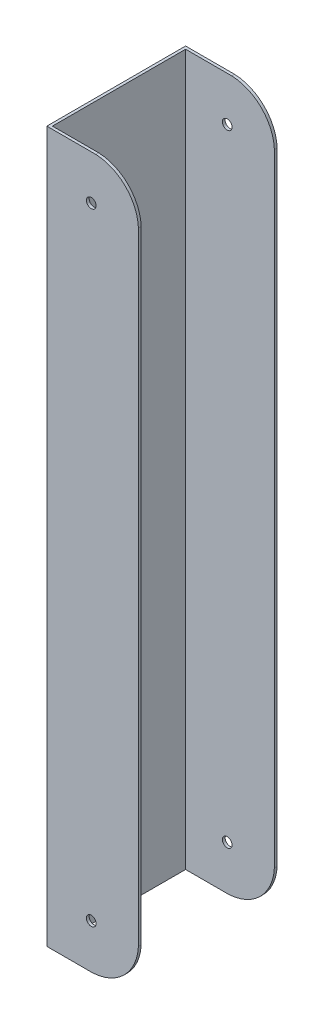
ISO-10303-21;
HEADER;
FILE_DESCRIPTION(('STEP AP214'),'2;1');
FILE_NAME('part.step','',(''),(''),'','','');
FILE_SCHEMA(('AUTOMOTIVE_DESIGN { 1 0 10303 214 1 1 1 1 }'));
ENDSEC;
DATA;
#1=APPLICATION_CONTEXT('core data for automotive mechanical design processes');
#2=APPLICATION_PROTOCOL_DEFINITION('international standard','automotive_design',2000,#1);
#3=PRODUCT_CONTEXT('',#1,'mechanical');
#4=PRODUCT('Part','Part','',(#3));
#5=PRODUCT_RELATED_PRODUCT_CATEGORY('part','',(#4));
#6=PRODUCT_DEFINITION_FORMATION('','',#4);
#7=PRODUCT_DEFINITION_CONTEXT('part definition',#1,'design');
#8=PRODUCT_DEFINITION('design','',#6,#7);
#9=PRODUCT_DEFINITION_SHAPE('','',#8);
#10=(LENGTH_UNIT() NAMED_UNIT(*) SI_UNIT(.MILLI.,.METRE.));
#11=(NAMED_UNIT(*) PLANE_ANGLE_UNIT() SI_UNIT($,.RADIAN.));
#12=(NAMED_UNIT(*) SI_UNIT($,.STERADIAN.) SOLID_ANGLE_UNIT());
#13=UNCERTAINTY_MEASURE_WITH_UNIT(LENGTH_MEASURE(1.E-05),#10,'distance_accuracy_value','');
#14=(GEOMETRIC_REPRESENTATION_CONTEXT(3) GLOBAL_UNCERTAINTY_ASSIGNED_CONTEXT((#13)) GLOBAL_UNIT_ASSIGNED_CONTEXT((#10,
#11,#12)) REPRESENTATION_CONTEXT('',''));
#15=CARTESIAN_POINT('',(0.,0.,0.));
#16=DIRECTION('',(0.,0.,1.));
#17=DIRECTION('',(1.,0.,0.));
#18=AXIS2_PLACEMENT_3D('',#15,#16,#17);
#19=CARTESIAN_POINT('',(-50.8,406.4,-1.58749999999998));
#20=DIRECTION('',(0.,0.,1.));
#21=DIRECTION('',(1.,0.,0.));
#22=AXIS2_PLACEMENT_3D('',#19,#20,#21);
#23=PLANE('',#22);
#24=CARTESIAN_POINT('',(-26.9875,25.4,-1.58749999999996));
#25=DIRECTION('',(0.,0.,1.));
#26=DIRECTION('',(1.,0.,0.));
#27=AXIS2_PLACEMENT_3D('',#24,#25,#26);
#28=CIRCLE('',#27,2.778125);
#29=CARTESIAN_POINT('',(-24.209375,25.4,-1.58749999999996));
#30=VERTEX_POINT('',#29);
#31=EDGE_CURVE('E231',#30,#30,#28,.T.);
#32=ORIENTED_EDGE('',*,*,#31,.T.);
#33=EDGE_LOOP('',(#32));
#34=FACE_BOUND('',#33,.T.);
#35=CARTESIAN_POINT('',(-26.9875,381.,-1.58749999999996));
#36=DIRECTION('',(0.,0.,1.));
#37=DIRECTION('',(1.,0.,0.));
#38=AXIS2_PLACEMENT_3D('',#35,#36,#37);
#39=CIRCLE('',#38,2.778125);
#40=CARTESIAN_POINT('',(-24.209375,381.,-1.58749999999996));
#41=VERTEX_POINT('',#40);
#42=EDGE_CURVE('E134',#41,#41,#39,.T.);
#43=ORIENTED_EDGE('',*,*,#42,.T.);
#44=EDGE_LOOP('',(#43));
#45=FACE_BOUND('',#44,.T.);
#46=DIRECTION('',(-1.,0.,0.));
#47=VECTOR('',#46,1.);
#48=CARTESIAN_POINT('',(-50.8,406.4,-1.58749999999998));
#49=LINE('',#48,#47);
#50=CARTESIAN_POINT('',(-24.3888362286901,406.4,-1.58749999999998));
#51=VERTEX_POINT('',#50);
#52=CARTESIAN_POINT('',(-50.8,406.4,-1.58749999999998));
#53=VERTEX_POINT('',#52);
#54=EDGE_CURVE('E161',#51,#53,#49,.T.);
#55=ORIENTED_EDGE('',*,*,#54,.F.);
#56=CARTESIAN_POINT('',(-25.2912931143452,381.108706885655,-1.58749999999996));
#57=DIRECTION('',(0.,0.,1.));
#58=DIRECTION('',(1.,0.,0.));
#59=AXIS2_PLACEMENT_3D('',#56,#57,#58);
#60=CIRCLE('',#59,25.3073889571048);
#61=CARTESIAN_POINT('',(0.,382.01116377131,-1.58749999999996));
#62=VERTEX_POINT('',#61);
#63=EDGE_CURVE('E56',#51,#62,#60,.F.);
#64=ORIENTED_EDGE('',*,*,#63,.T.);
#65=DIRECTION('',(0.,-1.,0.));
#66=VECTOR('',#65,1.);
#67=CARTESIAN_POINT('',(0.,406.4,-1.58749999999998));
#68=LINE('',#67,#66);
#69=CARTESIAN_POINT('',(0.,26.19375,-1.58749999999996));
#70=VERTEX_POINT('',#69);
#71=EDGE_CURVE('E177',#62,#70,#68,.T.);
#72=ORIENTED_EDGE('',*,*,#71,.T.);
#73=CARTESIAN_POINT('',(-27.6477853168564,27.6477853168564,-1.58749999999996));
#74=DIRECTION('',(0.,0.,1.));
#75=DIRECTION('',(1.,0.,0.));
#76=AXIS2_PLACEMENT_3D('',#73,#74,#75);
#77=CIRCLE('',#76,27.6859937807847);
#78=CARTESIAN_POINT('',(-26.19375,0.,-1.58749999999996));
#79=VERTEX_POINT('',#78);
#80=EDGE_CURVE('E150',#79,#70,#77,.T.);
#81=ORIENTED_EDGE('',*,*,#80,.F.);
#82=DIRECTION('',(-1.,0.,0.));
#83=VECTOR('',#82,1.);
#84=CARTESIAN_POINT('',(-50.8,0.,-1.58749999999998));
#85=LINE('',#84,#83);
#86=CARTESIAN_POINT('',(-50.8,0.,-1.58749999999998));
#87=VERTEX_POINT('',#86);
#88=EDGE_CURVE('E147',#79,#87,#85,.T.);
#89=ORIENTED_EDGE('',*,*,#88,.T.);
#90=DIRECTION('',(0.,-1.,0.));
#91=VECTOR('',#90,1.);
#92=CARTESIAN_POINT('',(-50.8,406.4,-1.58749999999998));
#93=LINE('',#92,#91);
#94=EDGE_CURVE('E174',#53,#87,#93,.T.);
#95=ORIENTED_EDGE('',*,*,#94,.F.);
#96=EDGE_LOOP('',(#55,#64,#72,#81,#89,#95));
#97=FACE_BOUND('',#96,.T.);
#98=ADVANCED_FACE('F33',(#34,#45,#97),#23,.F.);
#99=CARTESIAN_POINT('',(0.,406.4,-77.7875));
#100=DIRECTION('',(0.,0.,-1.));
#101=DIRECTION('',(-1.,0.,0.));
#102=AXIS2_PLACEMENT_3D('',#99,#100,#101);
#103=PLANE('',#102);
#104=CARTESIAN_POINT('',(-26.9875,25.4,-77.7875));
#105=DIRECTION('',(0.,0.,-1.));
#106=DIRECTION('',(-1.,0.,0.));
#107=AXIS2_PLACEMENT_3D('',#104,#105,#106);
#108=CIRCLE('',#107,2.778125);
#109=CARTESIAN_POINT('',(-29.765625,25.4,-77.7875));
#110=VERTEX_POINT('',#109);
#111=EDGE_CURVE('E234',#110,#110,#108,.T.);
#112=ORIENTED_EDGE('',*,*,#111,.T.);
#113=EDGE_LOOP('',(#112));
#114=FACE_BOUND('',#113,.T.);
#115=CARTESIAN_POINT('',(-26.9875,381.,-77.7875));
#116=DIRECTION('',(0.,0.,-1.));
#117=DIRECTION('',(-1.,0.,0.));
#118=AXIS2_PLACEMENT_3D('',#115,#116,#117);
#119=CIRCLE('',#118,2.778125);
#120=CARTESIAN_POINT('',(-29.765625,381.,-77.7875));
#121=VERTEX_POINT('',#120);
#122=EDGE_CURVE('E222',#121,#121,#119,.T.);
#123=ORIENTED_EDGE('',*,*,#122,.T.);
#124=EDGE_LOOP('',(#123));
#125=FACE_BOUND('',#124,.T.);
#126=DIRECTION('',(0.,-1.,0.));
#127=VECTOR('',#126,1.);
#128=CARTESIAN_POINT('',(0.,406.4,-77.7875));
#129=LINE('',#128,#127);
#130=CARTESIAN_POINT('',(0.,382.01116377131,-77.7875));
#131=VERTEX_POINT('',#130);
#132=CARTESIAN_POINT('',(0.,26.19375,-77.7875));
#133=VERTEX_POINT('',#132);
#134=EDGE_CURVE('E169',#131,#133,#129,.T.);
#135=ORIENTED_EDGE('',*,*,#134,.F.);
#136=CARTESIAN_POINT('',(-25.2912931143452,381.108706885655,-77.7875));
#137=DIRECTION('',(0.,0.,-1.));
#138=DIRECTION('',(-1.,0.,0.));
#139=AXIS2_PLACEMENT_3D('',#136,#137,#138);
#140=CIRCLE('',#139,25.3073889571048);
#141=CARTESIAN_POINT('',(-24.3888362286901,406.4,-77.7875));
#142=VERTEX_POINT('',#141);
#143=EDGE_CURVE('E215',#131,#142,#140,.F.);
#144=ORIENTED_EDGE('',*,*,#143,.T.);
#145=DIRECTION('',(1.,0.,0.));
#146=VECTOR('',#145,1.);
#147=CARTESIAN_POINT('',(0.,406.4,-77.7875));
#148=LINE('',#147,#146);
#149=CARTESIAN_POINT('',(-50.8,406.4,-77.7875));
#150=VERTEX_POINT('',#149);
#151=EDGE_CURVE('E191',#150,#142,#148,.T.);
#152=ORIENTED_EDGE('',*,*,#151,.F.);
#153=DIRECTION('',(0.,-1.,0.));
#154=VECTOR('',#153,1.);
#155=CARTESIAN_POINT('',(-50.8,406.4,-77.7875));
#156=LINE('',#155,#154);
#157=CARTESIAN_POINT('',(-50.8,0.,-77.7875));
#158=VERTEX_POINT('',#157);
#159=EDGE_CURVE('E171',#150,#158,#156,.T.);
#160=ORIENTED_EDGE('',*,*,#159,.T.);
#161=DIRECTION('',(1.,0.,0.));
#162=VECTOR('',#161,1.);
#163=CARTESIAN_POINT('',(0.,0.,-77.7875));
#164=LINE('',#163,#162);
#165=CARTESIAN_POINT('',(-26.19375,0.,-77.7875));
#166=VERTEX_POINT('',#165);
#167=EDGE_CURVE('E152',#158,#166,#164,.T.);
#168=ORIENTED_EDGE('',*,*,#167,.T.);
#169=CARTESIAN_POINT('',(-27.6477853168564,27.6477853168564,-77.7875));
#170=DIRECTION('',(0.,0.,-1.));
#171=DIRECTION('',(-1.,0.,0.));
#172=AXIS2_PLACEMENT_3D('',#169,#170,#171);
#173=CIRCLE('',#172,27.6859937807847);
#174=EDGE_CURVE('E203',#133,#166,#173,.T.);
#175=ORIENTED_EDGE('',*,*,#174,.F.);
#176=EDGE_LOOP('',(#135,#144,#152,#160,#168,#175));
#177=FACE_BOUND('',#176,.T.);
#178=ADVANCED_FACE('F261',(#114,#125,#177),#103,.F.);
#179=CARTESIAN_POINT('',(-52.3875,406.4,-79.375));
#180=DIRECTION('',(0.,0.,1.));
#181=DIRECTION('',(1.,0.,0.));
#182=AXIS2_PLACEMENT_3D('',#179,#180,#181);
#183=PLANE('',#182);
#184=CARTESIAN_POINT('',(-26.9875,25.4,-79.375));
#185=DIRECTION('',(0.,0.,1.));
#186=DIRECTION('',(1.,0.,0.));
#187=AXIS2_PLACEMENT_3D('',#184,#185,#186);
#188=CIRCLE('',#187,2.778125);
#189=CARTESIAN_POINT('',(-24.209375,25.4,-79.375));
#190=VERTEX_POINT('',#189);
#191=EDGE_CURVE('E237',#190,#190,#188,.T.);
#192=ORIENTED_EDGE('',*,*,#191,.T.);
#193=EDGE_LOOP('',(#192));
#194=FACE_BOUND('',#193,.T.);
#195=CARTESIAN_POINT('',(-26.9875,381.,-79.375));
#196=DIRECTION('',(0.,0.,1.));
#197=DIRECTION('',(1.,0.,0.));
#198=AXIS2_PLACEMENT_3D('',#195,#196,#197);
#199=CIRCLE('',#198,2.778125);
#200=CARTESIAN_POINT('',(-24.209375,381.,-79.375));
#201=VERTEX_POINT('',#200);
#202=EDGE_CURVE('E225',#201,#201,#199,.T.);
#203=ORIENTED_EDGE('',*,*,#202,.T.);
#204=EDGE_LOOP('',(#203));
#205=FACE_BOUND('',#204,.T.);
#206=DIRECTION('',(-1.,0.,0.));
#207=VECTOR('',#206,1.);
#208=CARTESIAN_POINT('',(-52.3875,406.4,-79.375));
#209=LINE('',#208,#207);
#210=CARTESIAN_POINT('',(-24.3888362286901,406.4,-79.375));
#211=VERTEX_POINT('',#210);
#212=CARTESIAN_POINT('',(-52.3875,406.4,-79.375));
#213=VERTEX_POINT('',#212);
#214=EDGE_CURVE('E143',#211,#213,#209,.T.);
#215=ORIENTED_EDGE('',*,*,#214,.F.);
#216=CARTESIAN_POINT('',(-25.2912931143452,381.108706885655,-79.375));
#217=DIRECTION('',(0.,0.,1.));
#218=DIRECTION('',(1.,0.,0.));
#219=AXIS2_PLACEMENT_3D('',#216,#217,#218);
#220=CIRCLE('',#219,25.3073889571048);
#221=CARTESIAN_POINT('',(0.,382.01116377131,-79.375));
#222=VERTEX_POINT('',#221);
#223=EDGE_CURVE('E48',#211,#222,#220,.F.);
#224=ORIENTED_EDGE('',*,*,#223,.T.);
#225=DIRECTION('',(0.,-1.,0.));
#226=VECTOR('',#225,1.);
#227=CARTESIAN_POINT('',(0.,406.4,-79.375));
#228=LINE('',#227,#226);
#229=CARTESIAN_POINT('',(0.,26.19375,-79.375));
#230=VERTEX_POINT('',#229);
#231=EDGE_CURVE('E167',#222,#230,#228,.T.);
#232=ORIENTED_EDGE('',*,*,#231,.T.);
#233=CARTESIAN_POINT('',(-27.6477853168564,27.6477853168564,-79.375));
#234=DIRECTION('',(0.,0.,1.));
#235=DIRECTION('',(1.,0.,0.));
#236=AXIS2_PLACEMENT_3D('',#233,#234,#235);
#237=CIRCLE('',#236,27.6859937807847);
#238=CARTESIAN_POINT('',(-26.19375,0.,-79.375));
#239=VERTEX_POINT('',#238);
#240=EDGE_CURVE('E205',#239,#230,#237,.T.);
#241=ORIENTED_EDGE('',*,*,#240,.F.);
#242=DIRECTION('',(-1.,0.,0.));
#243=VECTOR('',#242,1.);
#244=CARTESIAN_POINT('',(-52.3875,0.,-79.375));
#245=LINE('',#244,#243);
#246=CARTESIAN_POINT('',(-52.3875,0.,-79.375));
#247=VERTEX_POINT('',#246);
#248=EDGE_CURVE('E155',#239,#247,#245,.T.);
#249=ORIENTED_EDGE('',*,*,#248,.T.);
#250=DIRECTION('',(0.,-1.,0.));
#251=VECTOR('',#250,1.);
#252=CARTESIAN_POINT('',(-52.3875,406.4,-79.375));
#253=LINE('',#252,#251);
#254=EDGE_CURVE('E164',#213,#247,#253,.T.);
#255=ORIENTED_EDGE('',*,*,#254,.F.);
#256=EDGE_LOOP('',(#215,#224,#232,#241,#249,#255));
#257=FACE_BOUND('',#256,.T.);
#258=ADVANCED_FACE('F194',(#194,#205,#257),#183,.F.);
#259=CARTESIAN_POINT('',(0.,406.4,0.));
#260=DIRECTION('',(0.,0.,-1.));
#261=DIRECTION('',(-1.,0.,0.));
#262=AXIS2_PLACEMENT_3D('',#259,#260,#261);
#263=PLANE('',#262);
#264=CARTESIAN_POINT('',(-26.9875,25.4,0.));
#265=DIRECTION('',(0.,0.,1.));
#266=DIRECTION('',(1.,0.,0.));
#267=AXIS2_PLACEMENT_3D('',#264,#265,#266);
#268=CIRCLE('',#267,2.778125);
#269=CARTESIAN_POINT('',(-24.209375,25.4,0.));
#270=VERTEX_POINT('',#269);
#271=EDGE_CURVE('E240',#270,#270,#268,.T.);
#272=ORIENTED_EDGE('',*,*,#271,.F.);
#273=EDGE_LOOP('',(#272));
#274=FACE_BOUND('',#273,.T.);
#275=CARTESIAN_POINT('',(-26.9875,381.,0.));
#276=DIRECTION('',(0.,0.,1.));
#277=DIRECTION('',(1.,0.,0.));
#278=AXIS2_PLACEMENT_3D('',#275,#276,#277);
#279=CIRCLE('',#278,2.778125);
#280=CARTESIAN_POINT('',(-24.209375,381.,0.));
#281=VERTEX_POINT('',#280);
#282=EDGE_CURVE('E228',#281,#281,#279,.T.);
#283=ORIENTED_EDGE('',*,*,#282,.F.);
#284=EDGE_LOOP('',(#283));
#285=FACE_BOUND('',#284,.T.);
#286=DIRECTION('',(0.,-1.,0.));
#287=VECTOR('',#286,1.);
#288=CARTESIAN_POINT('',(0.,406.4,0.));
#289=LINE('',#288,#287);
#290=CARTESIAN_POINT('',(0.,382.01116377131,0.));
#291=VERTEX_POINT('',#290);
#292=CARTESIAN_POINT('',(0.,26.19375,0.));
#293=VERTEX_POINT('',#292);
#294=EDGE_CURVE('E132',#291,#293,#289,.T.);
#295=ORIENTED_EDGE('',*,*,#294,.F.);
#296=CARTESIAN_POINT('',(-25.2912931143452,381.108706885655,0.));
#297=DIRECTION('',(0.,0.,1.));
#298=DIRECTION('',(1.,0.,0.));
#299=AXIS2_PLACEMENT_3D('',#296,#297,#298);
#300=CIRCLE('',#299,25.3073889571048);
#301=CARTESIAN_POINT('',(-24.3888362286901,406.4,0.));
#302=VERTEX_POINT('',#301);
#303=EDGE_CURVE('E120',#302,#291,#300,.F.);
#304=ORIENTED_EDGE('',*,*,#303,.F.);
#305=DIRECTION('',(1.,0.,0.));
#306=VECTOR('',#305,1.);
#307=CARTESIAN_POINT('',(0.,406.4,0.));
#308=LINE('',#307,#306);
#309=CARTESIAN_POINT('',(-52.3875,406.4,0.));
#310=VERTEX_POINT('',#309);
#311=EDGE_CURVE('E130',#310,#302,#308,.T.);
#312=ORIENTED_EDGE('',*,*,#311,.F.);
#313=DIRECTION('',(0.,-1.,0.));
#314=VECTOR('',#313,1.);
#315=CARTESIAN_POINT('',(-52.3875,406.4,0.));
#316=LINE('',#315,#314);
#317=CARTESIAN_POINT('',(-52.3875,0.,0.));
#318=VERTEX_POINT('',#317);
#319=EDGE_CURVE('E141',#310,#318,#316,.T.);
#320=ORIENTED_EDGE('',*,*,#319,.T.);
#321=DIRECTION('',(1.,0.,0.));
#322=VECTOR('',#321,1.);
#323=CARTESIAN_POINT('',(0.,0.,0.));
#324=LINE('',#323,#322);
#325=CARTESIAN_POINT('',(-26.19375,0.,0.));
#326=VERTEX_POINT('',#325);
#327=EDGE_CURVE('E159',#318,#326,#324,.T.);
#328=ORIENTED_EDGE('',*,*,#327,.T.);
#329=CARTESIAN_POINT('',(-27.6477853168564,27.6477853168564,0.));
#330=DIRECTION('',(0.,0.,1.));
#331=DIRECTION('',(1.,0.,0.));
#332=AXIS2_PLACEMENT_3D('',#329,#330,#331);
#333=CIRCLE('',#332,27.6859937807847);
#334=EDGE_CURVE('E212',#326,#293,#333,.T.);
#335=ORIENTED_EDGE('',*,*,#334,.T.);
#336=EDGE_LOOP('',(#295,#304,#312,#320,#328,#335));
#337=FACE_BOUND('',#336,.T.);
#338=ADVANCED_FACE('F128',(#274,#285,#337),#263,.F.);
#339=CARTESIAN_POINT('',(0.,406.4,-1.58749999999998));
#340=DIRECTION('',(-1.,0.,0.));
#341=DIRECTION('',(0.,0.,1.));
#342=AXIS2_PLACEMENT_3D('',#339,#340,#341);
#343=PLANE('',#342);
#344=ORIENTED_EDGE('',*,*,#71,.F.);
#345=DIRECTION('',(0.,0.,1.));
#346=VECTOR('',#345,1.);
#347=CARTESIAN_POINT('',(0.,382.01116377131,-406.4));
#348=LINE('',#347,#346);
#349=EDGE_CURVE('E133',#62,#291,#348,.T.);
#350=ORIENTED_EDGE('',*,*,#349,.T.);
#351=ORIENTED_EDGE('',*,*,#294,.T.);
#352=DIRECTION('',(0.,0.,1.));
#353=VECTOR('',#352,1.);
#354=CARTESIAN_POINT('',(0.,26.19375,-406.4));
#355=LINE('',#354,#353);
#356=EDGE_CURVE('E209',#70,#293,#355,.T.);
#357=ORIENTED_EDGE('',*,*,#356,.F.);
#358=EDGE_LOOP('',(#344,#350,#351,#357));
#359=FACE_BOUND('',#358,.T.);
#360=ADVANCED_FACE('F35',(#359),#343,.F.);
#361=CARTESIAN_POINT('',(0.,406.4,-79.375));
#362=DIRECTION('',(-1.,0.,0.));
#363=DIRECTION('',(0.,0.,1.));
#364=AXIS2_PLACEMENT_3D('',#361,#362,#363);
#365=PLANE('',#364);
#366=ORIENTED_EDGE('',*,*,#231,.F.);
#367=EDGE_CURVE('E218',#222,#131,#348,.T.);
#368=ORIENTED_EDGE('',*,*,#367,.T.);
#369=ORIENTED_EDGE('',*,*,#134,.T.);
#370=EDGE_CURVE('E208',#230,#133,#355,.T.);
#371=ORIENTED_EDGE('',*,*,#370,.F.);
#372=EDGE_LOOP('',(#366,#368,#369,#371));
#373=FACE_BOUND('',#372,.T.);
#374=ADVANCED_FACE('F276',(#373),#365,.F.);
#375=CARTESIAN_POINT('',(0.,0.,0.));
#376=DIRECTION('',(0.,-1.,0.));
#377=DIRECTION('',(0.,0.,-1.));
#378=AXIS2_PLACEMENT_3D('',#375,#376,#377);
#379=PLANE('',#378);
#380=ORIENTED_EDGE('',*,*,#248,.F.);
#381=DIRECTION('',(0.,0.,1.));
#382=VECTOR('',#381,1.);
#383=CARTESIAN_POINT('',(-26.19375,0.,-406.4));
#384=LINE('',#383,#382);
#385=EDGE_CURVE('E180',#239,#166,#384,.T.);
#386=ORIENTED_EDGE('',*,*,#385,.T.);
#387=ORIENTED_EDGE('',*,*,#167,.F.);
#388=DIRECTION('',(0.,0.,-1.));
#389=VECTOR('',#388,1.);
#390=CARTESIAN_POINT('',(-50.8,0.,-77.7875));
#391=LINE('',#390,#389);
#392=EDGE_CURVE('E149',#87,#158,#391,.T.);
#393=ORIENTED_EDGE('',*,*,#392,.F.);
#394=ORIENTED_EDGE('',*,*,#88,.F.);
#395=EDGE_CURVE('E178',#79,#326,#384,.T.);
#396=ORIENTED_EDGE('',*,*,#395,.T.);
#397=ORIENTED_EDGE('',*,*,#327,.F.);
#398=DIRECTION('',(0.,0.,1.));
#399=VECTOR('',#398,1.);
#400=CARTESIAN_POINT('',(-52.3875,0.,0.));
#401=LINE('',#400,#399);
#402=EDGE_CURVE('E157',#247,#318,#401,.T.);
#403=ORIENTED_EDGE('',*,*,#402,.F.);
#404=EDGE_LOOP('',(#380,#386,#387,#393,#394,#396,#397,#403));
#405=FACE_BOUND('',#404,.T.);
#406=ADVANCED_FACE('F282',(#405),#379,.T.);
#407=CARTESIAN_POINT('',(-50.8,406.4,-77.7875));
#408=DIRECTION('',(-1.,0.,0.));
#409=DIRECTION('',(0.,0.,1.));
#410=AXIS2_PLACEMENT_3D('',#407,#408,#409);
#411=PLANE('',#410);
#412=ORIENTED_EDGE('',*,*,#392,.T.);
#413=ORIENTED_EDGE('',*,*,#159,.F.);
#414=DIRECTION('',(0.,0.,-1.));
#415=VECTOR('',#414,1.);
#416=CARTESIAN_POINT('',(-50.8,406.4,-77.7875));
#417=LINE('',#416,#415);
#418=EDGE_CURVE('E196',#53,#150,#417,.T.);
#419=ORIENTED_EDGE('',*,*,#418,.F.);
#420=ORIENTED_EDGE('',*,*,#94,.T.);
#421=EDGE_LOOP('',(#412,#413,#419,#420));
#422=FACE_BOUND('',#421,.T.);
#423=ADVANCED_FACE('F268',(#422),#411,.F.);
#424=CARTESIAN_POINT('',(-52.3875,406.4,0.));
#425=DIRECTION('',(1.,0.,0.));
#426=DIRECTION('',(0.,0.,-1.));
#427=AXIS2_PLACEMENT_3D('',#424,#425,#426);
#428=PLANE('',#427);
#429=ORIENTED_EDGE('',*,*,#402,.T.);
#430=ORIENTED_EDGE('',*,*,#319,.F.);
#431=DIRECTION('',(0.,0.,1.));
#432=VECTOR('',#431,1.);
#433=CARTESIAN_POINT('',(-52.3875,406.4,0.));
#434=LINE('',#433,#432);
#435=EDGE_CURVE('E138',#213,#310,#434,.T.);
#436=ORIENTED_EDGE('',*,*,#435,.F.);
#437=ORIENTED_EDGE('',*,*,#254,.T.);
#438=EDGE_LOOP('',(#429,#430,#436,#437));
#439=FACE_BOUND('',#438,.T.);
#440=ADVANCED_FACE('F304',(#439),#428,.F.);
#441=CARTESIAN_POINT('',(0.,406.4,0.));
#442=DIRECTION('',(0.,-1.,0.));
#443=DIRECTION('',(0.,0.,-1.));
#444=AXIS2_PLACEMENT_3D('',#441,#442,#443);
#445=PLANE('',#444);
#446=ORIENTED_EDGE('',*,*,#311,.T.);
#447=DIRECTION('',(0.,0.,1.));
#448=VECTOR('',#447,1.);
#449=CARTESIAN_POINT('',(-24.3888362286901,406.4,-406.4));
#450=LINE('',#449,#448);
#451=EDGE_CURVE('E11',#302,#51,#450,.F.);
#452=ORIENTED_EDGE('',*,*,#451,.T.);
#453=ORIENTED_EDGE('',*,*,#54,.T.);
#454=ORIENTED_EDGE('',*,*,#418,.T.);
#455=ORIENTED_EDGE('',*,*,#151,.T.);
#456=EDGE_CURVE('E37',#142,#211,#450,.F.);
#457=ORIENTED_EDGE('',*,*,#456,.T.);
#458=ORIENTED_EDGE('',*,*,#214,.T.);
#459=ORIENTED_EDGE('',*,*,#435,.T.);
#460=EDGE_LOOP('',(#446,#452,#453,#454,#455,#457,#458,#459));
#461=FACE_BOUND('',#460,.T.);
#462=ADVANCED_FACE('F136',(#461),#445,.F.);
#463=CARTESIAN_POINT('',(-27.6477853168564,27.6477853168564,-406.4));
#464=DIRECTION('',(0.,0.,1.));
#465=DIRECTION('',(1.,0.,0.));
#466=AXIS2_PLACEMENT_3D('',#463,#464,#465);
#467=CYLINDRICAL_SURFACE('',#466,27.6859937807847);
#468=ORIENTED_EDGE('',*,*,#80,.T.);
#469=ORIENTED_EDGE('',*,*,#356,.T.);
#470=ORIENTED_EDGE('',*,*,#334,.F.);
#471=ORIENTED_EDGE('',*,*,#395,.F.);
#472=EDGE_LOOP('',(#468,#469,#470,#471));
#473=FACE_BOUND('',#472,.T.);
#474=ADVANCED_FACE('F286',(#473),#467,.T.);
#475=ORIENTED_EDGE('',*,*,#174,.T.);
#476=ORIENTED_EDGE('',*,*,#385,.F.);
#477=ORIENTED_EDGE('',*,*,#240,.T.);
#478=ORIENTED_EDGE('',*,*,#370,.T.);
#479=EDGE_LOOP('',(#475,#476,#477,#478));
#480=FACE_BOUND('',#479,.T.);
#481=ADVANCED_FACE('F281',(#480),#467,.T.);
#482=CARTESIAN_POINT('',(-25.2912931143452,381.108706885655,-406.4));
#483=DIRECTION('',(0.,0.,1.));
#484=DIRECTION('',(1.,0.,0.));
#485=AXIS2_PLACEMENT_3D('',#482,#483,#484);
#486=CYLINDRICAL_SURFACE('',#485,25.3073889571048);
#487=ORIENTED_EDGE('',*,*,#367,.F.);
#488=ORIENTED_EDGE('',*,*,#223,.F.);
#489=ORIENTED_EDGE('',*,*,#456,.F.);
#490=ORIENTED_EDGE('',*,*,#143,.F.);
#491=EDGE_LOOP('',(#487,#488,#489,#490));
#492=FACE_BOUND('',#491,.T.);
#493=ADVANCED_FACE('F274',(#492),#486,.T.);
#494=ORIENTED_EDGE('',*,*,#451,.F.);
#495=ORIENTED_EDGE('',*,*,#303,.T.);
#496=ORIENTED_EDGE('',*,*,#349,.F.);
#497=ORIENTED_EDGE('',*,*,#63,.F.);
#498=EDGE_LOOP('',(#494,#495,#496,#497));
#499=FACE_BOUND('',#498,.T.);
#500=ADVANCED_FACE('F119',(#499),#486,.T.);
#501=CARTESIAN_POINT('',(-26.9875,381.,-406.4));
#502=DIRECTION('',(0.,0.,1.));
#503=DIRECTION('',(1.,0.,0.));
#504=AXIS2_PLACEMENT_3D('',#501,#502,#503);
#505=CYLINDRICAL_SURFACE('',#504,2.778125);
#506=ORIENTED_EDGE('',*,*,#282,.T.);
#507=EDGE_LOOP('',(#506));
#508=FACE_BOUND('',#507,.T.);
#509=ORIENTED_EDGE('',*,*,#42,.F.);
#510=EDGE_LOOP('',(#509));
#511=FACE_BOUND('',#510,.T.);
#512=ADVANCED_FACE('F252',(#508,#511),#505,.F.);
#513=ORIENTED_EDGE('',*,*,#202,.F.);
#514=EDGE_LOOP('',(#513));
#515=FACE_BOUND('',#514,.T.);
#516=ORIENTED_EDGE('',*,*,#122,.F.);
#517=EDGE_LOOP('',(#516));
#518=FACE_BOUND('',#517,.T.);
#519=ADVANCED_FACE('F255',(#515,#518),#505,.F.);
#520=CARTESIAN_POINT('',(-26.9875,25.4,-406.4));
#521=DIRECTION('',(0.,0.,1.));
#522=DIRECTION('',(1.,0.,0.));
#523=AXIS2_PLACEMENT_3D('',#520,#521,#522);
#524=CYLINDRICAL_SURFACE('',#523,2.778125);
#525=ORIENTED_EDGE('',*,*,#271,.T.);
#526=EDGE_LOOP('',(#525));
#527=FACE_BOUND('',#526,.T.);
#528=ORIENTED_EDGE('',*,*,#31,.F.);
#529=EDGE_LOOP('',(#528));
#530=FACE_BOUND('',#529,.T.);
#531=ADVANCED_FACE('F244',(#527,#530),#524,.F.);
#532=ORIENTED_EDGE('',*,*,#191,.F.);
#533=EDGE_LOOP('',(#532));
#534=FACE_BOUND('',#533,.T.);
#535=ORIENTED_EDGE('',*,*,#111,.F.);
#536=EDGE_LOOP('',(#535));
#537=FACE_BOUND('',#536,.T.);
#538=ADVANCED_FACE('F319',(#534,#537),#524,.F.);
#539=CLOSED_SHELL('',(#98,#178,#258,#338,#360,#374,#406,#423,#440,#462,#474,#481,#493,#500,#512,
#519,#531,#538));
#540=MANIFOLD_SOLID_BREP('B2',#539);
#541=ADVANCED_BREP_SHAPE_REPRESENTATION('',(#18,#540),#14);
#542=SHAPE_DEFINITION_REPRESENTATION(#9,#541);
ENDSEC;
END-ISO-10303-21;
